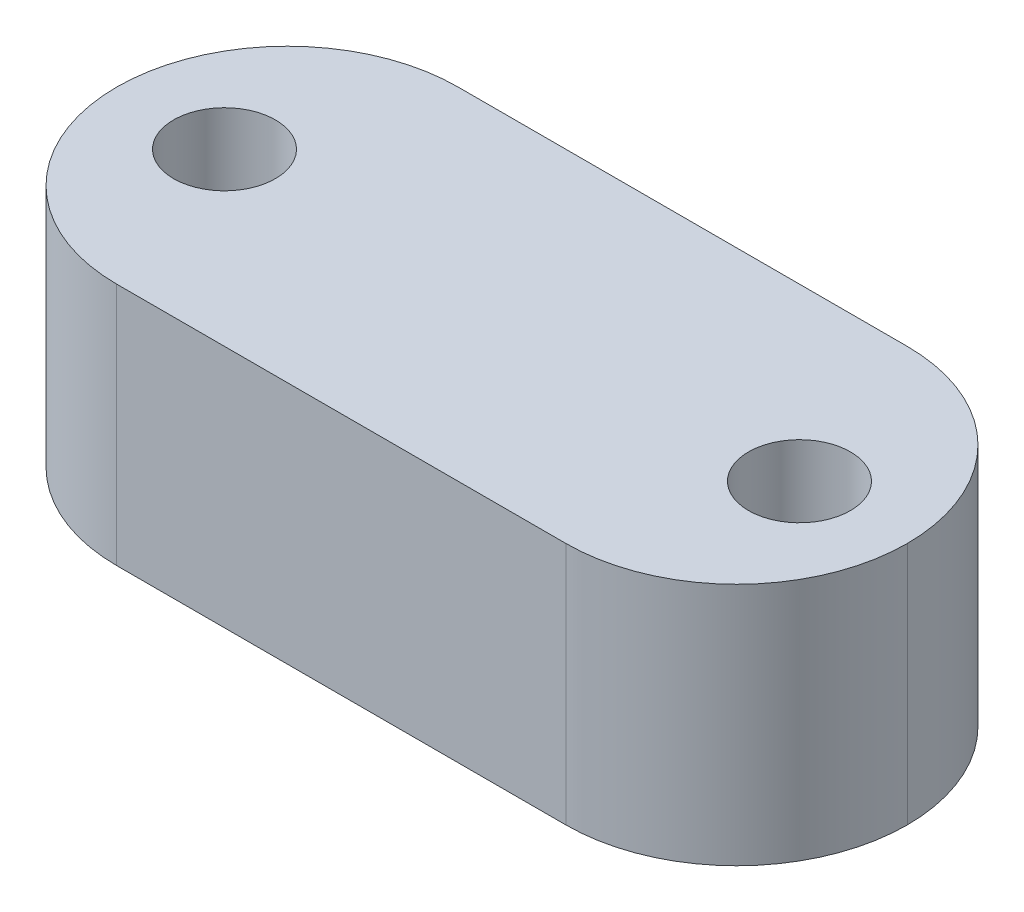
ISO-10303-21;
HEADER;
FILE_DESCRIPTION(('STEP AP214'),'2;1');
FILE_NAME('part.step','',(''),(''),'','','');
FILE_SCHEMA(('AUTOMOTIVE_DESIGN { 1 0 10303 214 1 1 1 1 }'));
ENDSEC;
DATA;
#1=APPLICATION_CONTEXT('core data for automotive mechanical design processes');
#2=APPLICATION_PROTOCOL_DEFINITION('international standard','automotive_design',2000,#1);
#3=PRODUCT_CONTEXT('',#1,'mechanical');
#4=PRODUCT('Part','Part','',(#3));
#5=PRODUCT_RELATED_PRODUCT_CATEGORY('part','',(#4));
#6=PRODUCT_DEFINITION_FORMATION('','',#4);
#7=PRODUCT_DEFINITION_CONTEXT('part definition',#1,'design');
#8=PRODUCT_DEFINITION('design','',#6,#7);
#9=PRODUCT_DEFINITION_SHAPE('','',#8);
#10=(LENGTH_UNIT() NAMED_UNIT(*) SI_UNIT(.MILLI.,.METRE.));
#11=(NAMED_UNIT(*) PLANE_ANGLE_UNIT() SI_UNIT($,.RADIAN.));
#12=(NAMED_UNIT(*) SI_UNIT($,.STERADIAN.) SOLID_ANGLE_UNIT());
#13=UNCERTAINTY_MEASURE_WITH_UNIT(LENGTH_MEASURE(1.E-05),#10,'distance_accuracy_value','');
#14=(GEOMETRIC_REPRESENTATION_CONTEXT(3) GLOBAL_UNCERTAINTY_ASSIGNED_CONTEXT((#13)) GLOBAL_UNIT_ASSIGNED_CONTEXT((#10,
#11,#12)) REPRESENTATION_CONTEXT('',''));
#15=CARTESIAN_POINT('',(0.,0.,0.));
#16=DIRECTION('',(0.,0.,1.));
#17=DIRECTION('',(1.,0.,0.));
#18=AXIS2_PLACEMENT_3D('',#15,#16,#17);
#19=CARTESIAN_POINT('',(-17.4625,10.7696,7.540625));
#20=DIRECTION('',(0.,0.,-1.));
#21=DIRECTION('',(-1.,0.,0.));
#22=AXIS2_PLACEMENT_3D('',#19,#20,#21);
#23=PLANE('',#22);
#24=DIRECTION('',(1.,0.,0.));
#25=VECTOR('',#24,1.);
#26=CARTESIAN_POINT('',(-17.4625,0.,7.540625));
#27=LINE('',#26,#25);
#28=CARTESIAN_POINT('',(-9.921875,0.,7.540625));
#29=VERTEX_POINT('',#28);
#30=CARTESIAN_POINT('',(9.921875,0.,7.540625));
#31=VERTEX_POINT('',#30);
#32=EDGE_CURVE('E108',#29,#31,#27,.T.);
#33=ORIENTED_EDGE('',*,*,#32,.T.);
#34=DIRECTION('',(0.,-1.,0.));
#35=VECTOR('',#34,1.);
#36=CARTESIAN_POINT('',(9.921875,10.7696,7.540625));
#37=LINE('',#36,#35);
#38=CARTESIAN_POINT('',(9.921875,10.7696,7.540625));
#39=VERTEX_POINT('',#38);
#40=EDGE_CURVE('E126',#31,#39,#37,.F.);
#41=ORIENTED_EDGE('',*,*,#40,.T.);
#42=DIRECTION('',(1.,0.,0.));
#43=VECTOR('',#42,1.);
#44=CARTESIAN_POINT('',(-17.4625,10.7696,7.540625));
#45=LINE('',#44,#43);
#46=CARTESIAN_POINT('',(-9.921875,10.7696,7.540625));
#47=VERTEX_POINT('',#46);
#48=EDGE_CURVE('E153',#47,#39,#45,.T.);
#49=ORIENTED_EDGE('',*,*,#48,.F.);
#50=DIRECTION('',(0.,-1.,0.));
#51=VECTOR('',#50,1.);
#52=CARTESIAN_POINT('',(-9.921875,10.7696,7.540625));
#53=LINE('',#52,#51);
#54=EDGE_CURVE('E124',#47,#29,#53,.T.);
#55=ORIENTED_EDGE('',*,*,#54,.T.);
#56=EDGE_LOOP('',(#33,#41,#49,#55));
#57=FACE_BOUND('',#56,.T.);
#58=ADVANCED_FACE('F44',(#57),#23,.F.);
#59=CARTESIAN_POINT('',(-17.4625,10.7696,-7.540625));
#60=DIRECTION('',(0.,0.,1.));
#61=DIRECTION('',(1.,0.,0.));
#62=AXIS2_PLACEMENT_3D('',#59,#60,#61);
#63=PLANE('',#62);
#64=DIRECTION('',(-1.,0.,0.));
#65=VECTOR('',#64,1.);
#66=CARTESIAN_POINT('',(-17.4625,10.7696,-7.540625));
#67=LINE('',#66,#65);
#68=CARTESIAN_POINT('',(9.921875,10.7696,-7.540625));
#69=VERTEX_POINT('',#68);
#70=CARTESIAN_POINT('',(-9.921875,10.7696,-7.540625));
#71=VERTEX_POINT('',#70);
#72=EDGE_CURVE('E111',#69,#71,#67,.T.);
#73=ORIENTED_EDGE('',*,*,#72,.F.);
#74=DIRECTION('',(0.,-1.,0.));
#75=VECTOR('',#74,1.);
#76=CARTESIAN_POINT('',(9.921875,10.7696,-7.540625));
#77=LINE('',#76,#75);
#78=CARTESIAN_POINT('',(9.921875,0.,-7.540625));
#79=VERTEX_POINT('',#78);
#80=EDGE_CURVE('E13',#69,#79,#77,.T.);
#81=ORIENTED_EDGE('',*,*,#80,.T.);
#82=DIRECTION('',(-1.,0.,0.));
#83=VECTOR('',#82,1.);
#84=CARTESIAN_POINT('',(-17.4625,0.,-7.540625));
#85=LINE('',#84,#83);
#86=CARTESIAN_POINT('',(-9.921875,0.,-7.540625));
#87=VERTEX_POINT('',#86);
#88=EDGE_CURVE('E156',#79,#87,#85,.T.);
#89=ORIENTED_EDGE('',*,*,#88,.T.);
#90=DIRECTION('',(0.,-1.,0.));
#91=VECTOR('',#90,1.);
#92=CARTESIAN_POINT('',(-9.921875,10.7696,-7.540625));
#93=LINE('',#92,#91);
#94=EDGE_CURVE('E53',#87,#71,#93,.F.);
#95=ORIENTED_EDGE('',*,*,#94,.T.);
#96=EDGE_LOOP('',(#73,#81,#89,#95));
#97=FACE_BOUND('',#96,.T.);
#98=ADVANCED_FACE('F159',(#97),#63,.F.);
#99=CARTESIAN_POINT('',(-17.4625,10.7696,7.540625));
#100=DIRECTION('',(0.,1.,0.));
#101=DIRECTION('',(0.,0.,1.));
#102=AXIS2_PLACEMENT_3D('',#99,#100,#101);
#103=PLANE('',#102);
#104=CARTESIAN_POINT('',(-12.7,10.7696,0.));
#105=DIRECTION('',(0.,1.,0.));
#106=DIRECTION('',(0.,0.,1.));
#107=AXIS2_PLACEMENT_3D('',#104,#105,#106);
#108=CIRCLE('',#107,2.24999999999999);
#109=CARTESIAN_POINT('',(-12.7,10.7696,2.24999999999998));
#110=VERTEX_POINT('',#109);
#111=EDGE_CURVE('E135',#110,#110,#108,.T.);
#112=ORIENTED_EDGE('',*,*,#111,.F.);
#113=EDGE_LOOP('',(#112));
#114=FACE_BOUND('',#113,.T.);
#115=CARTESIAN_POINT('',(12.7,10.7696,0.));
#116=DIRECTION('',(0.,1.,0.));
#117=DIRECTION('',(0.,0.,1.));
#118=AXIS2_PLACEMENT_3D('',#115,#116,#117);
#119=CIRCLE('',#118,2.24999999999999);
#120=CARTESIAN_POINT('',(12.7,10.7696,2.24999999999998));
#121=VERTEX_POINT('',#120);
#122=EDGE_CURVE('E145',#121,#121,#119,.T.);
#123=ORIENTED_EDGE('',*,*,#122,.F.);
#124=EDGE_LOOP('',(#123));
#125=FACE_BOUND('',#124,.T.);
#126=ORIENTED_EDGE('',*,*,#48,.T.);
#127=CARTESIAN_POINT('',(9.921875,10.7696,0.));
#128=DIRECTION('',(0.,1.,0.));
#129=DIRECTION('',(0.,0.,1.));
#130=AXIS2_PLACEMENT_3D('',#127,#128,#129);
#131=CIRCLE('',#130,7.540625);
#132=CARTESIAN_POINT('',(17.4625,10.7696,0.));
#133=VERTEX_POINT('',#132);
#134=EDGE_CURVE('E132',#39,#133,#131,.T.);
#135=ORIENTED_EDGE('',*,*,#134,.T.);
#136=CARTESIAN_POINT('',(9.921875,10.7696,0.));
#137=DIRECTION('',(0.,1.,0.));
#138=DIRECTION('',(0.,0.,1.));
#139=AXIS2_PLACEMENT_3D('',#136,#137,#138);
#140=CIRCLE('',#139,7.540625);
#141=EDGE_CURVE('E69',#133,#69,#140,.T.);
#142=ORIENTED_EDGE('',*,*,#141,.T.);
#143=ORIENTED_EDGE('',*,*,#72,.T.);
#144=CARTESIAN_POINT('',(-9.921875,10.7696,0.));
#145=DIRECTION('',(0.,1.,0.));
#146=DIRECTION('',(0.,0.,1.));
#147=AXIS2_PLACEMENT_3D('',#144,#145,#146);
#148=CIRCLE('',#147,7.540625);
#149=CARTESIAN_POINT('',(-17.4625,10.7696,0.));
#150=VERTEX_POINT('',#149);
#151=EDGE_CURVE('E61',#71,#150,#148,.T.);
#152=ORIENTED_EDGE('',*,*,#151,.T.);
#153=CARTESIAN_POINT('',(-9.921875,10.7696,0.));
#154=DIRECTION('',(0.,1.,0.));
#155=DIRECTION('',(0.,0.,1.));
#156=AXIS2_PLACEMENT_3D('',#153,#154,#155);
#157=CIRCLE('',#156,7.540625);
#158=EDGE_CURVE('E114',#150,#47,#157,.T.);
#159=ORIENTED_EDGE('',*,*,#158,.T.);
#160=EDGE_LOOP('',(#126,#135,#142,#143,#152,#159));
#161=FACE_BOUND('',#160,.T.);
#162=ADVANCED_FACE('F168',(#114,#125,#161),#103,.T.);
#163=CARTESIAN_POINT('',(-17.4625,0.,7.540625));
#164=DIRECTION('',(0.,1.,0.));
#165=DIRECTION('',(0.,0.,1.));
#166=AXIS2_PLACEMENT_3D('',#163,#164,#165);
#167=PLANE('',#166);
#168=CARTESIAN_POINT('',(-12.7,0.,0.));
#169=DIRECTION('',(0.,1.,0.));
#170=DIRECTION('',(0.,0.,1.));
#171=AXIS2_PLACEMENT_3D('',#168,#169,#170);
#172=CIRCLE('',#171,2.25);
#173=CARTESIAN_POINT('',(-12.7,0.,2.25));
#174=VERTEX_POINT('',#173);
#175=EDGE_CURVE('E140',#174,#174,#172,.T.);
#176=ORIENTED_EDGE('',*,*,#175,.T.);
#177=EDGE_LOOP('',(#176));
#178=FACE_BOUND('',#177,.T.);
#179=CARTESIAN_POINT('',(12.7,0.,0.));
#180=DIRECTION('',(0.,1.,0.));
#181=DIRECTION('',(0.,0.,1.));
#182=AXIS2_PLACEMENT_3D('',#179,#180,#181);
#183=CIRCLE('',#182,2.25);
#184=CARTESIAN_POINT('',(12.7,0.,2.25));
#185=VERTEX_POINT('',#184);
#186=EDGE_CURVE('E150',#185,#185,#183,.T.);
#187=ORIENTED_EDGE('',*,*,#186,.T.);
#188=EDGE_LOOP('',(#187));
#189=FACE_BOUND('',#188,.T.);
#190=CARTESIAN_POINT('',(9.921875,0.,0.));
#191=DIRECTION('',(0.,1.,0.));
#192=DIRECTION('',(0.,0.,1.));
#193=AXIS2_PLACEMENT_3D('',#190,#191,#192);
#194=CIRCLE('',#193,7.540625);
#195=CARTESIAN_POINT('',(17.4625,0.,0.));
#196=VERTEX_POINT('',#195);
#197=EDGE_CURVE('E117',#79,#196,#194,.F.);
#198=ORIENTED_EDGE('',*,*,#197,.T.);
#199=CARTESIAN_POINT('',(9.921875,0.,0.));
#200=DIRECTION('',(0.,1.,0.));
#201=DIRECTION('',(0.,0.,1.));
#202=AXIS2_PLACEMENT_3D('',#199,#200,#201);
#203=CIRCLE('',#202,7.540625);
#204=EDGE_CURVE('E119',#196,#31,#203,.F.);
#205=ORIENTED_EDGE('',*,*,#204,.T.);
#206=ORIENTED_EDGE('',*,*,#32,.F.);
#207=CARTESIAN_POINT('',(-9.921875,0.,0.));
#208=DIRECTION('',(0.,1.,0.));
#209=DIRECTION('',(0.,0.,1.));
#210=AXIS2_PLACEMENT_3D('',#207,#208,#209);
#211=CIRCLE('',#210,7.540625);
#212=CARTESIAN_POINT('',(-17.4625,0.,0.));
#213=VERTEX_POINT('',#212);
#214=EDGE_CURVE('E100',#29,#213,#211,.F.);
#215=ORIENTED_EDGE('',*,*,#214,.T.);
#216=CARTESIAN_POINT('',(-9.921875,0.,0.));
#217=DIRECTION('',(0.,1.,0.));
#218=DIRECTION('',(0.,0.,1.));
#219=AXIS2_PLACEMENT_3D('',#216,#217,#218);
#220=CIRCLE('',#219,7.540625);
#221=EDGE_CURVE('E105',#213,#87,#220,.F.);
#222=ORIENTED_EDGE('',*,*,#221,.T.);
#223=ORIENTED_EDGE('',*,*,#88,.F.);
#224=EDGE_LOOP('',(#198,#205,#206,#215,#222,#223));
#225=FACE_BOUND('',#224,.T.);
#226=ADVANCED_FACE('F102',(#178,#189,#225),#167,.F.);
#227=CARTESIAN_POINT('',(12.7,10.7696,0.));
#228=DIRECTION('',(0.,1.,0.));
#229=DIRECTION('',(0.,0.,1.));
#230=AXIS2_PLACEMENT_3D('',#227,#228,#229);
#231=CYLINDRICAL_SURFACE('',#230,2.24999999999999);
#232=ORIENTED_EDGE('',*,*,#186,.F.);
#233=EDGE_LOOP('',(#232));
#234=FACE_BOUND('',#233,.T.);
#235=ORIENTED_EDGE('',*,*,#122,.T.);
#236=EDGE_LOOP('',(#235));
#237=FACE_BOUND('',#236,.T.);
#238=ADVANCED_FACE('F176',(#234,#237),#231,.F.);
#239=CARTESIAN_POINT('',(-12.7,10.7696,0.));
#240=DIRECTION('',(0.,1.,0.));
#241=DIRECTION('',(0.,0.,1.));
#242=AXIS2_PLACEMENT_3D('',#239,#240,#241);
#243=CYLINDRICAL_SURFACE('',#242,2.24999999999999);
#244=ORIENTED_EDGE('',*,*,#175,.F.);
#245=EDGE_LOOP('',(#244));
#246=FACE_BOUND('',#245,.T.);
#247=ORIENTED_EDGE('',*,*,#111,.T.);
#248=EDGE_LOOP('',(#247));
#249=FACE_BOUND('',#248,.T.);
#250=ADVANCED_FACE('F190',(#246,#249),#243,.F.);
#251=CARTESIAN_POINT('',(9.921875,10.7696,0.));
#252=DIRECTION('',(0.,-1.,0.));
#253=DIRECTION('',(0.,0.,-1.));
#254=AXIS2_PLACEMENT_3D('',#251,#252,#253);
#255=CYLINDRICAL_SURFACE('',#254,7.540625);
#256=ORIENTED_EDGE('',*,*,#80,.F.);
#257=ORIENTED_EDGE('',*,*,#141,.F.);
#258=DIRECTION('',(0.,-1.,0.));
#259=VECTOR('',#258,1.);
#260=CARTESIAN_POINT('',(17.4625,10.7696,0.));
#261=LINE('',#260,#259);
#262=EDGE_CURVE('E115',#196,#133,#261,.F.);
#263=ORIENTED_EDGE('',*,*,#262,.F.);
#264=ORIENTED_EDGE('',*,*,#197,.F.);
#265=EDGE_LOOP('',(#256,#257,#263,#264));
#266=FACE_BOUND('',#265,.T.);
#267=ADVANCED_FACE('F163',(#266),#255,.T.);
#268=CARTESIAN_POINT('',(9.921875,10.7696,0.));
#269=DIRECTION('',(0.,-1.,0.));
#270=DIRECTION('',(0.,0.,-1.));
#271=AXIS2_PLACEMENT_3D('',#268,#269,#270);
#272=CYLINDRICAL_SURFACE('',#271,7.540625);
#273=ORIENTED_EDGE('',*,*,#134,.F.);
#274=ORIENTED_EDGE('',*,*,#40,.F.);
#275=ORIENTED_EDGE('',*,*,#204,.F.);
#276=ORIENTED_EDGE('',*,*,#262,.T.);
#277=EDGE_LOOP('',(#273,#274,#275,#276));
#278=FACE_BOUND('',#277,.T.);
#279=ADVANCED_FACE('F165',(#278),#272,.T.);
#280=CARTESIAN_POINT('',(-9.921875,10.7696,0.));
#281=DIRECTION('',(0.,-1.,0.));
#282=DIRECTION('',(0.,0.,-1.));
#283=AXIS2_PLACEMENT_3D('',#280,#281,#282);
#284=CYLINDRICAL_SURFACE('',#283,7.540625);
#285=ORIENTED_EDGE('',*,*,#54,.F.);
#286=ORIENTED_EDGE('',*,*,#158,.F.);
#287=DIRECTION('',(0.,-1.,0.));
#288=VECTOR('',#287,1.);
#289=CARTESIAN_POINT('',(-17.4625,10.7696,0.));
#290=LINE('',#289,#288);
#291=EDGE_CURVE('E48',#213,#150,#290,.F.);
#292=ORIENTED_EDGE('',*,*,#291,.F.);
#293=ORIENTED_EDGE('',*,*,#214,.F.);
#294=EDGE_LOOP('',(#285,#286,#292,#293));
#295=FACE_BOUND('',#294,.T.);
#296=ADVANCED_FACE('F46',(#295),#284,.T.);
#297=CARTESIAN_POINT('',(-9.921875,10.7696,0.));
#298=DIRECTION('',(0.,-1.,0.));
#299=DIRECTION('',(0.,0.,-1.));
#300=AXIS2_PLACEMENT_3D('',#297,#298,#299);
#301=CYLINDRICAL_SURFACE('',#300,7.540625);
#302=ORIENTED_EDGE('',*,*,#151,.F.);
#303=ORIENTED_EDGE('',*,*,#94,.F.);
#304=ORIENTED_EDGE('',*,*,#221,.F.);
#305=ORIENTED_EDGE('',*,*,#291,.T.);
#306=EDGE_LOOP('',(#302,#303,#304,#305));
#307=FACE_BOUND('',#306,.T.);
#308=ADVANCED_FACE('F116',(#307),#301,.T.);
#309=CLOSED_SHELL('',(#58,#98,#162,#226,#238,#250,#267,#279,#296,#308));
#310=MANIFOLD_SOLID_BREP('B2',#309);
#311=ADVANCED_BREP_SHAPE_REPRESENTATION('',(#18,#310),#14);
#312=SHAPE_DEFINITION_REPRESENTATION(#9,#311);
ENDSEC;
END-ISO-10303-21;
